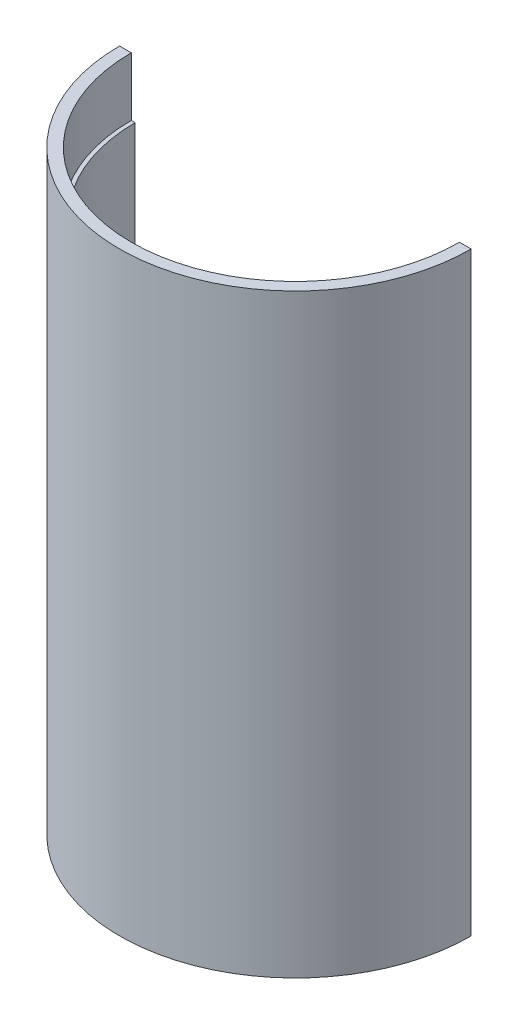
ISO-10303-21;
HEADER;
FILE_DESCRIPTION(('STEP AP214'),'2;1');
FILE_NAME('part.step','',(''),(''),'','','');
FILE_SCHEMA(('AUTOMOTIVE_DESIGN { 1 0 10303 214 1 1 1 1 }'));
ENDSEC;
DATA;
#1=APPLICATION_CONTEXT('core data for automotive mechanical design processes');
#2=APPLICATION_PROTOCOL_DEFINITION('international standard','automotive_design',2000,#1);
#3=PRODUCT_CONTEXT('',#1,'mechanical');
#4=PRODUCT('Part','Part','',(#3));
#5=PRODUCT_RELATED_PRODUCT_CATEGORY('part','',(#4));
#6=PRODUCT_DEFINITION_FORMATION('','',#4);
#7=PRODUCT_DEFINITION_CONTEXT('part definition',#1,'design');
#8=PRODUCT_DEFINITION('design','',#6,#7);
#9=PRODUCT_DEFINITION_SHAPE('','',#8);
#10=(LENGTH_UNIT() NAMED_UNIT(*) SI_UNIT(.MILLI.,.METRE.));
#11=(NAMED_UNIT(*) PLANE_ANGLE_UNIT() SI_UNIT($,.RADIAN.));
#12=(NAMED_UNIT(*) SI_UNIT($,.STERADIAN.) SOLID_ANGLE_UNIT());
#13=UNCERTAINTY_MEASURE_WITH_UNIT(LENGTH_MEASURE(1.E-05),#10,'distance_accuracy_value','');
#14=(GEOMETRIC_REPRESENTATION_CONTEXT(3) GLOBAL_UNCERTAINTY_ASSIGNED_CONTEXT((#13)) GLOBAL_UNIT_ASSIGNED_CONTEXT((#10,
#11,#12)) REPRESENTATION_CONTEXT('',''));
#15=CARTESIAN_POINT('',(0.,0.,0.));
#16=DIRECTION('',(0.,0.,1.));
#17=DIRECTION('',(1.,0.,0.));
#18=AXIS2_PLACEMENT_3D('',#15,#16,#17);
#19=CARTESIAN_POINT('',(0.,0.,0.));
#20=DIRECTION('',(0.,0.,-1.));
#21=DIRECTION('',(-1.,0.,0.));
#22=AXIS2_PLACEMENT_3D('',#19,#20,#21);
#23=PLANE('',#22);
#24=DIRECTION('',(1.,0.,0.));
#25=VECTOR('',#24,1.);
#26=CARTESIAN_POINT('',(-45.,50.75,0.));
#27=LINE('',#26,#25);
#28=CARTESIAN_POINT('',(-45.,50.75,0.));
#29=VERTEX_POINT('',#28);
#30=CARTESIAN_POINT('',(-41.,50.75,0.));
#31=VERTEX_POINT('',#30);
#32=EDGE_CURVE('E11',#29,#31,#27,.T.);
#33=ORIENTED_EDGE('',*,*,#32,.F.);
#34=DIRECTION('',(0.,-1.,0.));
#35=VECTOR('',#34,1.);
#36=CARTESIAN_POINT('',(-45.,0.,0.));
#37=LINE('',#36,#35);
#38=CARTESIAN_POINT('',(-45.,81.05,0.));
#39=VERTEX_POINT('',#38);
#40=EDGE_CURVE('E143',#39,#29,#37,.T.);
#41=ORIENTED_EDGE('',*,*,#40,.F.);
#42=DIRECTION('',(1.,0.,0.));
#43=VECTOR('',#42,1.);
#44=CARTESIAN_POINT('',(-45.,81.05,0.));
#45=LINE('',#44,#43);
#46=CARTESIAN_POINT('',(-41.,81.05,0.));
#47=VERTEX_POINT('',#46);
#48=EDGE_CURVE('E124',#47,#39,#45,.F.);
#49=ORIENTED_EDGE('',*,*,#48,.F.);
#50=DIRECTION('',(0.,1.,0.));
#51=VECTOR('',#50,1.);
#52=CARTESIAN_POINT('',(-41.,137.3,0.));
#53=LINE('',#52,#51);
#54=EDGE_CURVE('E165',#31,#47,#53,.T.);
#55=ORIENTED_EDGE('',*,*,#54,.F.);
#56=EDGE_LOOP('',(#33,#41,#49,#55));
#57=FACE_BOUND('',#56,.T.);
#58=ADVANCED_FACE('F33',(#57),#23,.T.);
#59=DIRECTION('',(1.,0.,0.));
#60=VECTOR('',#59,1.);
#61=CARTESIAN_POINT('',(-45.,101.95,0.));
#62=LINE('',#61,#60);
#63=CARTESIAN_POINT('',(-45.,101.95,0.));
#64=VERTEX_POINT('',#63);
#65=CARTESIAN_POINT('',(-41.,101.95,0.));
#66=VERTEX_POINT('',#65);
#67=EDGE_CURVE('E123',#64,#66,#62,.T.);
#68=ORIENTED_EDGE('',*,*,#67,.F.);
#69=CARTESIAN_POINT('',(-45.,152.3,0.));
#70=VERTEX_POINT('',#69);
#71=EDGE_CURVE('E135',#70,#64,#37,.T.);
#72=ORIENTED_EDGE('',*,*,#71,.F.);
#73=DIRECTION('',(-1.,0.,0.));
#74=VECTOR('',#73,1.);
#75=CARTESIAN_POINT('',(-45.,152.3,0.));
#76=LINE('',#75,#74);
#77=CARTESIAN_POINT('',(-42.,152.3,0.));
#78=VERTEX_POINT('',#77);
#79=EDGE_CURVE('E150',#78,#70,#76,.T.);
#80=ORIENTED_EDGE('',*,*,#79,.F.);
#81=DIRECTION('',(0.,1.,0.));
#82=VECTOR('',#81,1.);
#83=CARTESIAN_POINT('',(-42.,152.3,0.));
#84=LINE('',#83,#82);
#85=CARTESIAN_POINT('',(-42.,137.3,0.));
#86=VERTEX_POINT('',#85);
#87=EDGE_CURVE('E154',#86,#78,#84,.T.);
#88=ORIENTED_EDGE('',*,*,#87,.F.);
#89=DIRECTION('',(-1.,0.,0.));
#90=VECTOR('',#89,1.);
#91=CARTESIAN_POINT('',(-42.,137.3,0.));
#92=LINE('',#91,#90);
#93=CARTESIAN_POINT('',(-41.,137.3,0.));
#94=VERTEX_POINT('',#93);
#95=EDGE_CURVE('E157',#94,#86,#92,.T.);
#96=ORIENTED_EDGE('',*,*,#95,.F.);
#97=EDGE_CURVE('E137',#66,#94,#53,.T.);
#98=ORIENTED_EDGE('',*,*,#97,.F.);
#99=EDGE_LOOP('',(#68,#72,#80,#88,#96,#98));
#100=FACE_BOUND('',#99,.T.);
#101=ADVANCED_FACE('F133',(#100),#23,.T.);
#102=CARTESIAN_POINT('',(43.,0.,-3.00267395140509E-13));
#103=DIRECTION('',(0.,1.,0.));
#104=DIRECTION('',(0.,0.,1.));
#105=AXIS2_PLACEMENT_3D('',#102,#103,#104);
#106=PLANE('',#105);
#107=CARTESIAN_POINT('',(0.,0.,0.));
#108=DIRECTION('',(0.,-1.,0.));
#109=DIRECTION('',(0.,0.,-1.));
#110=AXIS2_PLACEMENT_3D('',#107,#108,#109);
#111=CIRCLE('',#110,45.);
#112=CARTESIAN_POINT('',(45.,0.,-3.14233320495882E-13));
#113=VERTEX_POINT('',#112);
#114=CARTESIAN_POINT('',(-45.,0.,0.));
#115=VERTEX_POINT('',#114);
#116=EDGE_CURVE('E267',#113,#115,#111,.T.);
#117=ORIENTED_EDGE('',*,*,#116,.T.);
#118=DIRECTION('',(1.,0.,0.));
#119=VECTOR('',#118,1.);
#120=CARTESIAN_POINT('',(-43.,0.,0.));
#121=LINE('',#120,#119);
#122=CARTESIAN_POINT('',(-43.,0.,0.));
#123=VERTEX_POINT('',#122);
#124=EDGE_CURVE('E172',#115,#123,#121,.T.);
#125=ORIENTED_EDGE('',*,*,#124,.T.);
#126=CARTESIAN_POINT('',(0.,0.,0.));
#127=DIRECTION('',(0.,-1.,0.));
#128=DIRECTION('',(0.,0.,-1.));
#129=AXIS2_PLACEMENT_3D('',#126,#127,#128);
#130=CIRCLE('',#129,43.);
#131=CARTESIAN_POINT('',(43.,0.,-3.00267395140509E-13));
#132=VERTEX_POINT('',#131);
#133=EDGE_CURVE('E265',#132,#123,#130,.T.);
#134=ORIENTED_EDGE('',*,*,#133,.F.);
#135=DIRECTION('',(-1.,0.,0.));
#136=VECTOR('',#135,1.);
#137=CARTESIAN_POINT('',(43.,0.,-3.00267395140509E-13));
#138=LINE('',#137,#136);
#139=EDGE_CURVE('E142',#113,#132,#138,.T.);
#140=ORIENTED_EDGE('',*,*,#139,.F.);
#141=EDGE_LOOP('',(#117,#125,#134,#140));
#142=FACE_BOUND('',#141,.T.);
#143=ADVANCED_FACE('F229',(#142),#106,.F.);
#144=CARTESIAN_POINT('',(0.,0.,0.));
#145=DIRECTION('',(0.,-1.,0.));
#146=DIRECTION('',(0.,0.,-1.));
#147=AXIS2_PLACEMENT_3D('',#144,#145,#146);
#148=CYLINDRICAL_SURFACE('',#147,45.);
#149=ORIENTED_EDGE('',*,*,#40,.T.);
#150=CARTESIAN_POINT('',(-45.,50.75,0.));
#151=CARTESIAN_POINT('',(-45.0000276800155,50.7500357210877,0.289777309725672));
#152=CARTESIAN_POINT('',(-44.9972019436401,50.7379483375954,0.57954460689438));
#153=CARTESIAN_POINT('',(-44.9860445335122,50.6897890919595,1.15693275383033));
#154=CARTESIAN_POINT('',(-44.9777136395787,50.6537206267896,1.44455390177006));
#155=CARTESIAN_POINT('',(-44.9557658770075,50.5579444786907,2.01510816846415));
#156=CARTESIAN_POINT('',(-44.9421582610212,50.4982781705925,2.29804859427394));
#157=CARTESIAN_POINT('',(-44.9100408958557,50.3558002662414,2.8577546093441));
#158=CARTESIAN_POINT('',(-44.891531109013,50.2729884921616,3.13452015114513));
#159=CARTESIAN_POINT('',(-44.8501147355752,50.0848706756729,3.67994982852666));
#160=CARTESIAN_POINT('',(-44.827208218106,49.9795649869138,3.94861409139983));
#161=CARTESIAN_POINT('',(-44.7776201597931,49.7472556749073,4.47603613105494));
#162=CARTESIAN_POINT('',(-44.7509384933737,49.6202513298512,4.73479357793464));
#163=CARTESIAN_POINT('',(-44.6945151440581,49.3454552017206,5.24071761689439));
#164=CARTESIAN_POINT('',(-44.6647730406244,49.1976605608047,5.48788260923275));
#165=CARTESIAN_POINT('',(-44.6030274796608,48.8823339966548,5.9689839026558));
#166=CARTESIAN_POINT('',(-44.5710240009458,48.714801888505,6.20292007977238));
#167=CARTESIAN_POINT('',(-44.5050924762665,48.3583439515707,6.65964135297352));
#168=CARTESIAN_POINT('',(-44.4711420462593,48.1691225371176,6.88219256689107));
#169=CARTESIAN_POINT('',(-44.4027063740719,47.7726809108777,7.31073056333741));
#170=CARTESIAN_POINT('',(-44.3682209066601,47.5654529402645,7.51671013096726));
#171=CARTESIAN_POINT('',(-44.2996758377473,47.1344021322261,7.91067094745145));
#172=CARTESIAN_POINT('',(-44.2656163178082,46.9105761717422,8.09864879379812));
#173=CARTESIAN_POINT('',(-44.1988949480916,46.4479407299924,8.45521016672256));
#174=CARTESIAN_POINT('',(-44.1662324808841,46.2091379852729,8.62380231764495));
#175=CARTESIAN_POINT('',(-44.102805978378,45.714870135673,8.94255342556756));
#176=CARTESIAN_POINT('',(-44.07207175211,45.4592302709518,9.09244750411398));
#177=CARTESIAN_POINT('',(-44.0138722700214,44.9358467715346,9.37012181144229));
#178=CARTESIAN_POINT('',(-43.986407049653,44.6681030056152,9.49790180040344));
#179=CARTESIAN_POINT('',(-43.9355744123609,44.1224295907866,9.73033721907349));
#180=CARTESIAN_POINT('',(-43.9122063453421,43.8445015662892,9.83499631805872));
#181=CARTESIAN_POINT('',(-43.8702780793081,43.2804177252759,10.0203663892489));
#182=CARTESIAN_POINT('',(-43.8517177816039,42.994262077782,10.1010778530311));
#183=CARTESIAN_POINT('',(-43.8202587597688,42.4208699091378,10.236683348427));
#184=CARTESIAN_POINT('',(-43.8072670590479,42.1337390177997,10.2920025549074));
#185=CARTESIAN_POINT('',(-43.7868786377794,41.5556558022234,10.3784023672529));
#186=CARTESIAN_POINT('',(-43.7794818586421,41.2647035180351,10.4094832269407));
#187=CARTESIAN_POINT('',(-43.7705115128661,40.6811565609188,10.447138279155));
#188=CARTESIAN_POINT('',(-43.768937370472,40.3885620532433,10.4537148947167));
#189=CARTESIAN_POINT('',(-43.7716595109905,39.8038813767438,10.44231098683));
#190=CARTESIAN_POINT('',(-43.7759557250889,39.5117952020011,10.4243307512446));
#191=CARTESIAN_POINT('',(-43.7901365482015,38.9363331148385,10.36459622385));
#192=CARTESIAN_POINT('',(-43.7999034561101,38.6529021621148,10.3233425266223));
#193=CARTESIAN_POINT('',(-43.8246509352537,38.0906056127654,10.2177739892246));
#194=CARTESIAN_POINT('',(-43.8396314235995,37.8117399436316,10.1534595156903));
#195=CARTESIAN_POINT('',(-43.8743711704448,37.260489161261,10.0022778543845));
#196=CARTESIAN_POINT('',(-43.8941305939915,36.9881042722038,9.91540988768915));
#197=CARTESIAN_POINT('',(-43.9378623089173,36.4516598870526,9.71978867776954));
#198=CARTESIAN_POINT('',(-43.9618346578823,36.1876005048167,9.61103513539172));
#199=CARTESIAN_POINT('',(-44.0135418022761,35.6672940932836,9.37140774386989));
#200=CARTESIAN_POINT('',(-44.0413074905735,35.4111349218959,9.24034983651237));
#201=CARTESIAN_POINT('',(-44.0996692587863,34.9106462470551,8.95767801468011));
#202=CARTESIAN_POINT('',(-44.1302663170916,34.666320877578,8.80605698605593));
#203=CARTESIAN_POINT('',(-44.1934355695442,34.1911787630675,8.48335264270418));
#204=CARTESIAN_POINT('',(-44.2260076239021,33.9603610642351,8.31227070466109));
#205=CARTESIAN_POINT('',(-44.2922435633056,33.5136801809737,7.95177574041558));
#206=CARTESIAN_POINT('',(-44.3259074663898,33.2978172438002,7.76236241125391));
#207=CARTESIAN_POINT('',(-44.3942521323976,32.8773172454835,7.36156910330172));
#208=CARTESIAN_POINT('',(-44.428937567788,32.673085953596,7.14976396086327));
#209=CARTESIAN_POINT('',(-44.4975237403146,32.28320857827,6.70969054621079));
#210=CARTESIAN_POINT('',(-44.5314247174091,32.0975567521945,6.48142739868475));
#211=CARTESIAN_POINT('',(-44.5975233947688,31.7459701227995,6.00979385571237));
#212=CARTESIAN_POINT('',(-44.6297203277866,31.5800441598631,5.76641676059641));
#213=CARTESIAN_POINT('',(-44.6914942814793,31.2691986936579,5.26629010249474));
#214=CARTESIAN_POINT('',(-44.7210713884812,31.1242784981188,5.00954098057933));
#215=CARTESIAN_POINT('',(-44.7768669634992,30.8560821526274,4.48356343270576));
#216=CARTESIAN_POINT('',(-44.8030742475729,30.7328775963967,4.2142972950596));
#217=CARTESIAN_POINT('',(-44.8512704622542,30.5096554891393,3.6659612448561));
#218=CARTESIAN_POINT('',(-44.8732595601175,30.4096370187265,3.38689172153288));
#219=CARTESIAN_POINT('',(-44.9123652967802,30.2336991585479,2.82129393809283));
#220=CARTESIAN_POINT('',(-44.9294877494991,30.1577510006794,2.53477502801466));
#221=CARTESIAN_POINT('',(-44.9583943090884,30.0304548356529,1.95617799466032));
#222=CARTESIAN_POINT('',(-44.9701809147014,29.9790953131466,1.66410254039114));
#223=CARTESIAN_POINT('',(-44.9860526551791,29.9101823705245,1.14311820517071));
#224=CARTESIAN_POINT('',(-44.9912777925168,29.8876053942516,0.914894978036251));
#225=CARTESIAN_POINT('',(-44.9982534977653,29.8575212566626,0.457787633365784));
#226=CARTESIAN_POINT('',(-45.0000098480237,29.8499890160567,0.228905253699298));
#227=CARTESIAN_POINT('',(-45.,29.85,0.));
#228=B_SPLINE_CURVE_WITH_KNOTS('',3,(#150,#151,#152,#153,#154,#155,#156,#157,#158,#159,#160,
#161,#162,#163,#164,#165,#166,#167,#168,#169,#170,#171,#172,#173,#174,#175,#176,#177,#178,#179,
#180,#181,#182,#183,#184,#185,#186,#187,#188,#189,#190,#191,#192,#193,#194,#195,#196,#197,#198,
#199,#200,#201,#202,#203,#204,#205,#206,#207,#208,#209,#210,#211,#212,#213,#214,#215,#216,#217,
#218,#219,#220,#221,#222,#223,#224,#225,#226,#227),.UNSPECIFIED.,.F.,.F.,(4,2,2,2,2,2,2,2,2,2,2,
2,2,2,2,2,2,2,2,2,2,2,2,2,2,2,2,2,2,2,2,2,2,2,2,2,2,2,4),(0.,0.869051020991656,1.73797896518927,
2.60539009752773,3.47280789437725,4.34021205467291,5.20764507490828,6.07519744952519,
6.94275795268703,7.82399292451696,8.70560951180641,9.58739240603099,10.4687814807012,
11.3615031237839,12.2542344475604,13.1468239932811,14.039395215396,14.9164206554535,
15.7934369112204,16.6703664433302,17.5472856958948,18.4060252787349,19.2647512093627,
20.1235068015189,20.9822741327883,21.8485060790335,22.7150384805929,23.581509620848,
24.447995083546,25.3357556572325,26.2232409843077,27.1111225611052,27.9989748700519,
28.889701685639,29.7803931756462,30.6700160885064,31.559221964677,32.246910182196,
32.9334510765203),.UNSPECIFIED.);
#229=CARTESIAN_POINT('',(-45.,29.85,0.));
#230=VERTEX_POINT('',#229);
#231=EDGE_CURVE('E175',#29,#230,#228,.T.);
#232=ORIENTED_EDGE('',*,*,#231,.T.);
#233=EDGE_CURVE('E145',#230,#115,#37,.T.);
#234=ORIENTED_EDGE('',*,*,#233,.T.);
#235=ORIENTED_EDGE('',*,*,#116,.F.);
#236=DIRECTION('',(0.,-1.,0.));
#237=VECTOR('',#236,1.);
#238=CARTESIAN_POINT('',(45.,0.,-3.14233320495882E-13));
#239=LINE('',#238,#237);
#240=CARTESIAN_POINT('',(45.,152.3,-3.14233320495882E-13));
#241=VERTEX_POINT('',#240);
#242=EDGE_CURVE('E281',#241,#113,#239,.T.);
#243=ORIENTED_EDGE('',*,*,#242,.F.);
#244=CARTESIAN_POINT('',(0.,152.3,0.));
#245=DIRECTION('',(0.,-1.,0.));
#246=DIRECTION('',(0.,0.,-1.));
#247=AXIS2_PLACEMENT_3D('',#244,#245,#246);
#248=CIRCLE('',#247,45.);
#249=EDGE_CURVE('E140',#241,#70,#248,.T.);
#250=ORIENTED_EDGE('',*,*,#249,.T.);
#251=ORIENTED_EDGE('',*,*,#71,.T.);
#252=CARTESIAN_POINT('',(-45.,101.95,0.));
#253=CARTESIAN_POINT('',(-45.0000276800155,101.950035721088,0.289777309725673));
#254=CARTESIAN_POINT('',(-44.9972019436401,101.937948337595,0.57954460689438));
#255=CARTESIAN_POINT('',(-44.9860445335122,101.88978909196,1.15693275383033));
#256=CARTESIAN_POINT('',(-44.9777136395787,101.85372062679,1.44455390177006));
#257=CARTESIAN_POINT('',(-44.9557658770075,101.757944478691,2.01510816846415));
#258=CARTESIAN_POINT('',(-44.9421582610212,101.698278170593,2.29804859427394));
#259=CARTESIAN_POINT('',(-44.9100408958557,101.555800266241,2.8577546093441));
#260=CARTESIAN_POINT('',(-44.891531109013,101.472988492162,3.13452015114513));
#261=CARTESIAN_POINT('',(-44.8501147355752,101.284870675673,3.67994982852666));
#262=CARTESIAN_POINT('',(-44.827208218106,101.179564986914,3.94861409139983));
#263=CARTESIAN_POINT('',(-44.7776201597931,100.947255674907,4.47603613105494));
#264=CARTESIAN_POINT('',(-44.7509384933737,100.820251329851,4.73479357793464));
#265=CARTESIAN_POINT('',(-44.6945151440581,100.545455201721,5.24071761689439));
#266=CARTESIAN_POINT('',(-44.6647730406244,100.397660560805,5.48788260923275));
#267=CARTESIAN_POINT('',(-44.6030274796608,100.082333996655,5.96898390265581));
#268=CARTESIAN_POINT('',(-44.5710240009458,99.914801888505,6.20292007977238));
#269=CARTESIAN_POINT('',(-44.5050924762665,99.5583439515707,6.65964135297353));
#270=CARTESIAN_POINT('',(-44.4711420462593,99.3691225371176,6.88219256689109));
#271=CARTESIAN_POINT('',(-44.4027063740719,98.9726809108777,7.31073056333743));
#272=CARTESIAN_POINT('',(-44.3682209066601,98.7654529402645,7.51671013096727));
#273=CARTESIAN_POINT('',(-44.2996758377473,98.334402132226,7.91067094745146));
#274=CARTESIAN_POINT('',(-44.2656163178082,98.1105761717422,8.09864879379813));
#275=CARTESIAN_POINT('',(-44.1988949480916,97.6479407299924,8.45521016672256));
#276=CARTESIAN_POINT('',(-44.1662324808841,97.4091379852729,8.62380231764496));
#277=CARTESIAN_POINT('',(-44.102805978378,96.914870135673,8.94255342556756));
#278=CARTESIAN_POINT('',(-44.07207175211,96.6592302709518,9.09244750411399));
#279=CARTESIAN_POINT('',(-44.0138722700214,96.1358467715346,9.37012181144229));
#280=CARTESIAN_POINT('',(-43.986407049653,95.8681030056152,9.49790180040345));
#281=CARTESIAN_POINT('',(-43.9355744123609,95.3224295907866,9.73033721907349));
#282=CARTESIAN_POINT('',(-43.9122063453421,95.0445015662893,9.83499631805872));
#283=CARTESIAN_POINT('',(-43.8702780793081,94.4804177252759,10.0203663892489));
#284=CARTESIAN_POINT('',(-43.8517177816039,94.194262077782,10.1010778530311));
#285=CARTESIAN_POINT('',(-43.8202587597688,93.6208699091379,10.236683348427));
#286=CARTESIAN_POINT('',(-43.8072670590479,93.3337390177998,10.2920025549074));
#287=CARTESIAN_POINT('',(-43.7868786377794,92.7556558022234,10.3784023672529));
#288=CARTESIAN_POINT('',(-43.7794818586421,92.4647035180351,10.4094832269407));
#289=CARTESIAN_POINT('',(-43.7705115128661,91.8811565609188,10.4471382791551));
#290=CARTESIAN_POINT('',(-43.768937370472,91.5885620532433,10.4537148947167));
#291=CARTESIAN_POINT('',(-43.7716595109905,91.0038813767438,10.44231098683));
#292=CARTESIAN_POINT('',(-43.7759557250889,90.7117952020012,10.4243307512446));
#293=CARTESIAN_POINT('',(-43.7901365482015,90.1363331148385,10.36459622385));
#294=CARTESIAN_POINT('',(-43.7999034561101,89.8529021621148,10.3233425266223));
#295=CARTESIAN_POINT('',(-43.8246509352537,89.2906056127654,10.2177739892246));
#296=CARTESIAN_POINT('',(-43.8396314235995,89.0117399436316,10.1534595156903));
#297=CARTESIAN_POINT('',(-43.8743711704448,88.460489161261,10.0022778543845));
#298=CARTESIAN_POINT('',(-43.8941305939915,88.1881042722038,9.91540988768916));
#299=CARTESIAN_POINT('',(-43.9378623089173,87.6516598870526,9.71978867776956));
#300=CARTESIAN_POINT('',(-43.9618346578823,87.3876005048167,9.61103513539174));
#301=CARTESIAN_POINT('',(-44.0135418022761,86.8672940932836,9.37140774386991));
#302=CARTESIAN_POINT('',(-44.0413074905735,86.6111349218959,9.24034983651239));
#303=CARTESIAN_POINT('',(-44.0996692587862,86.1106462470552,8.95767801468013));
#304=CARTESIAN_POINT('',(-44.1302663170916,85.866320877578,8.80605698605595));
#305=CARTESIAN_POINT('',(-44.1934355695442,85.3911787630676,8.4833526427042));
#306=CARTESIAN_POINT('',(-44.2260076239021,85.1603610642351,8.31227070466112));
#307=CARTESIAN_POINT('',(-44.2922435633056,84.7136801809737,7.95177574041561));
#308=CARTESIAN_POINT('',(-44.3259074663898,84.4978172438002,7.76236241125393));
#309=CARTESIAN_POINT('',(-44.3942521323976,84.0773172454835,7.36156910330174));
#310=CARTESIAN_POINT('',(-44.428937567788,83.873085953596,7.14976396086329));
#311=CARTESIAN_POINT('',(-44.4975237403145,83.4832085782701,6.70969054621081));
#312=CARTESIAN_POINT('',(-44.5314247174091,83.2975567521945,6.48142739868477));
#313=CARTESIAN_POINT('',(-44.5975233947688,82.9459701227995,6.0097938557124));
#314=CARTESIAN_POINT('',(-44.6297203277866,82.7800441598632,5.76641676059644));
#315=CARTESIAN_POINT('',(-44.6914942814793,82.4691986936579,5.26629010249476));
#316=CARTESIAN_POINT('',(-44.7210713884812,82.3242784981188,5.00954098057935));
#317=CARTESIAN_POINT('',(-44.7768669634992,82.0560821526274,4.48356343270578));
#318=CARTESIAN_POINT('',(-44.8030742475729,81.9328775963967,4.21429729505962));
#319=CARTESIAN_POINT('',(-44.8512704622542,81.7096554891393,3.66596124485612));
#320=CARTESIAN_POINT('',(-44.8732595601175,81.6096370187265,3.3868917215329));
#321=CARTESIAN_POINT('',(-44.9123652967802,81.433699158548,2.82129393809285));
#322=CARTESIAN_POINT('',(-44.9294877494991,81.3577510006794,2.53477502801468));
#323=CARTESIAN_POINT('',(-44.9583943090884,81.2304548356529,1.95617799466034));
#324=CARTESIAN_POINT('',(-44.9701809147014,81.1790953131466,1.66410254039116));
#325=CARTESIAN_POINT('',(-44.9860526551791,81.1101823705245,1.14311820517072));
#326=CARTESIAN_POINT('',(-44.9912777925168,81.0876053942516,0.914894978036265));
#327=CARTESIAN_POINT('',(-44.9982534977653,81.0575212566626,0.457787633365793));
#328=CARTESIAN_POINT('',(-45.0000098480237,81.0499890160566,0.228905253699304));
#329=CARTESIAN_POINT('',(-45.,81.05,0.));
#330=B_SPLINE_CURVE_WITH_KNOTS('',3,(#252,#253,#254,#255,#256,#257,#258,#259,#260,#261,#262,
#263,#264,#265,#266,#267,#268,#269,#270,#271,#272,#273,#274,#275,#276,#277,#278,#279,#280,#281,
#282,#283,#284,#285,#286,#287,#288,#289,#290,#291,#292,#293,#294,#295,#296,#297,#298,#299,#300,
#301,#302,#303,#304,#305,#306,#307,#308,#309,#310,#311,#312,#313,#314,#315,#316,#317,#318,#319,
#320,#321,#322,#323,#324,#325,#326,#327,#328,#329),.UNSPECIFIED.,.F.,.F.,(4,2,2,2,2,2,2,2,2,2,2,
2,2,2,2,2,2,2,2,2,2,2,2,2,2,2,2,2,2,2,2,2,2,2,2,2,2,2,4),(0.,0.869051020991656,1.73797896518928,
2.60539009752773,3.47280789437725,4.34021205467291,5.20764507490828,6.07519744952519,
6.94275795268703,7.82399292451697,8.70560951180641,9.58739240603099,10.4687814807012,
11.3615031237839,12.2542344475604,13.146823993281,14.039395215396,14.9164206554535,
15.7934369112204,16.6703664433302,17.5472856958948,18.4060252787349,19.2647512093627,
20.1235068015189,20.9822741327882,21.8485060790335,22.7150384805928,23.581509620848,
24.447995083546,25.3357556572325,26.2232409843077,27.1111225611052,27.9989748700519,
28.889701685639,29.7803931756462,30.6700160885064,31.5592219646771,32.246910182196,
32.9334510765203),.UNSPECIFIED.);
#331=EDGE_CURVE('E120',#64,#39,#330,.T.);
#332=ORIENTED_EDGE('',*,*,#331,.T.);
#333=EDGE_LOOP('',(#149,#232,#234,#235,#243,#250,#251,#332));
#334=FACE_BOUND('',#333,.T.);
#335=ADVANCED_FACE('F35',(#334),#148,.T.);
#336=CARTESIAN_POINT('',(45.,152.3,-3.14233320495882E-13));
#337=DIRECTION('',(0.,-1.,0.));
#338=DIRECTION('',(0.,0.,-1.));
#339=AXIS2_PLACEMENT_3D('',#336,#337,#338);
#340=PLANE('',#339);
#341=CARTESIAN_POINT('',(0.,152.3,0.));
#342=DIRECTION('',(0.,-1.,0.));
#343=DIRECTION('',(0.,0.,-1.));
#344=AXIS2_PLACEMENT_3D('',#341,#342,#343);
#345=CIRCLE('',#344,42.);
#346=CARTESIAN_POINT('',(42.,152.3,-2.93284432462823E-13));
#347=VERTEX_POINT('',#346);
#348=EDGE_CURVE('E271',#347,#78,#345,.T.);
#349=ORIENTED_EDGE('',*,*,#348,.T.);
#350=ORIENTED_EDGE('',*,*,#79,.T.);
#351=ORIENTED_EDGE('',*,*,#249,.F.);
#352=DIRECTION('',(1.,0.,0.));
#353=VECTOR('',#352,1.);
#354=CARTESIAN_POINT('',(45.,152.3,-3.14233320495882E-13));
#355=LINE('',#354,#353);
#356=EDGE_CURVE('E283',#347,#241,#355,.T.);
#357=ORIENTED_EDGE('',*,*,#356,.F.);
#358=EDGE_LOOP('',(#349,#350,#351,#357));
#359=FACE_BOUND('',#358,.T.);
#360=ADVANCED_FACE('F222',(#359),#340,.F.);
#361=CARTESIAN_POINT('',(0.,0.,0.));
#362=DIRECTION('',(0.,-1.,0.));
#363=DIRECTION('',(0.,0.,-1.));
#364=AXIS2_PLACEMENT_3D('',#361,#362,#363);
#365=CYLINDRICAL_SURFACE('',#364,42.);
#366=CARTESIAN_POINT('',(0.,137.3,0.));
#367=DIRECTION('',(0.,-1.,0.));
#368=DIRECTION('',(0.,0.,-1.));
#369=AXIS2_PLACEMENT_3D('',#366,#367,#368);
#370=CIRCLE('',#369,42.);
#371=CARTESIAN_POINT('',(42.,137.3,-2.93284432462823E-13));
#372=VERTEX_POINT('',#371);
#373=EDGE_CURVE('E275',#372,#86,#370,.T.);
#374=ORIENTED_EDGE('',*,*,#373,.T.);
#375=ORIENTED_EDGE('',*,*,#87,.T.);
#376=ORIENTED_EDGE('',*,*,#348,.F.);
#377=DIRECTION('',(0.,1.,0.));
#378=VECTOR('',#377,1.);
#379=CARTESIAN_POINT('',(42.,152.3,-2.93284432462823E-13));
#380=LINE('',#379,#378);
#381=EDGE_CURVE('E286',#372,#347,#380,.T.);
#382=ORIENTED_EDGE('',*,*,#381,.F.);
#383=EDGE_LOOP('',(#374,#375,#376,#382));
#384=FACE_BOUND('',#383,.T.);
#385=ADVANCED_FACE('F219',(#384),#365,.F.);
#386=CARTESIAN_POINT('',(42.,137.3,-2.93284432462823E-13));
#387=DIRECTION('',(0.,-1.,0.));
#388=DIRECTION('',(0.,0.,-1.));
#389=AXIS2_PLACEMENT_3D('',#386,#387,#388);
#390=PLANE('',#389);
#391=CARTESIAN_POINT('',(0.,137.3,0.));
#392=DIRECTION('',(0.,-1.,0.));
#393=DIRECTION('',(0.,0.,-1.));
#394=AXIS2_PLACEMENT_3D('',#391,#392,#393);
#395=CIRCLE('',#394,41.);
#396=CARTESIAN_POINT('',(41.,137.3,-2.86301469785137E-13));
#397=VERTEX_POINT('',#396);
#398=EDGE_CURVE('E258',#397,#94,#395,.T.);
#399=ORIENTED_EDGE('',*,*,#398,.T.);
#400=ORIENTED_EDGE('',*,*,#95,.T.);
#401=ORIENTED_EDGE('',*,*,#373,.F.);
#402=DIRECTION('',(1.,0.,0.));
#403=VECTOR('',#402,1.);
#404=CARTESIAN_POINT('',(42.,137.3,-2.93284432462823E-13));
#405=LINE('',#404,#403);
#406=EDGE_CURVE('E289',#397,#372,#405,.T.);
#407=ORIENTED_EDGE('',*,*,#406,.F.);
#408=EDGE_LOOP('',(#399,#400,#401,#407));
#409=FACE_BOUND('',#408,.T.);
#410=ADVANCED_FACE('F213',(#409),#390,.F.);
#411=CARTESIAN_POINT('',(0.,0.,0.));
#412=DIRECTION('',(0.,-1.,0.));
#413=DIRECTION('',(0.,0.,-1.));
#414=AXIS2_PLACEMENT_3D('',#411,#412,#413);
#415=CYLINDRICAL_SURFACE('',#414,41.);
#416=CARTESIAN_POINT('',(-41.,15.,0.));
#417=VERTEX_POINT('',#416);
#418=CARTESIAN_POINT('',(-41.,29.85,0.));
#419=VERTEX_POINT('',#418);
#420=EDGE_CURVE('E162',#417,#419,#53,.T.);
#421=ORIENTED_EDGE('',*,*,#420,.T.);
#422=CARTESIAN_POINT('',(-41.,29.85,0.));
#423=CARTESIAN_POINT('',(-41.0000300908221,29.8499634960627,0.288949045719678));
#424=CARTESIAN_POINT('',(-40.9969464954975,29.8619828111729,0.577887055905711));
#425=CARTESIAN_POINT('',(-40.9847705103606,29.9098650124593,1.15360853633391));
#426=CARTESIAN_POINT('',(-40.9756790787604,29.9457240963479,1.4403923427822));
#427=CARTESIAN_POINT('',(-40.9517291598623,30.0409253463215,2.00921327123784));
#428=CARTESIAN_POINT('',(-40.9368819124435,30.1002217487195,2.29125853347753));
#429=CARTESIAN_POINT('',(-40.9018368426846,30.2417949489011,2.84918040889963));
#430=CARTESIAN_POINT('',(-40.8816389591213,30.3240720096356,3.12505695145886));
#431=CARTESIAN_POINT('',(-40.8364462022114,30.5109224896339,3.66865761120273));
#432=CARTESIAN_POINT('',(-40.8114526525844,30.6154897571441,3.93638395446634));
#433=CARTESIAN_POINT('',(-40.7573281291748,30.8461718034927,4.46206839064162));
#434=CARTESIAN_POINT('',(-40.7281956014181,30.9722946789826,4.7200227683968));
#435=CARTESIAN_POINT('',(-40.6665825242039,31.2451074055102,5.22432707858392));
#436=CARTESIAN_POINT('',(-40.6341026263814,31.391793255534,5.47067925607087));
#437=CARTESIAN_POINT('',(-40.5666331634962,31.7047929970163,5.95037617701195));
#438=CARTESIAN_POINT('',(-40.5316424540135,31.8711158615424,6.18371490174975));
#439=CARTESIAN_POINT('',(-40.4594036244395,32.2255646164054,6.64010958075305));
#440=CARTESIAN_POINT('',(-40.4221252173564,32.4140451865979,6.86288535167456));
#441=CARTESIAN_POINT('',(-40.3469665486965,32.8088229375611,7.29175400391124));
#442=CARTESIAN_POINT('',(-40.3090865527214,33.0151124248499,7.49785401537473));
#443=CARTESIAN_POINT('',(-40.2337254509553,33.4443583970056,7.89225432057257));
#444=CARTESIAN_POINT('',(-40.1962445964451,33.6673247453319,8.08054392894189));
#445=CARTESIAN_POINT('',(-40.1227591803274,34.1282866435724,8.43785890872699));
#446=CARTESIAN_POINT('',(-40.086754071784,34.3662765409068,8.60689145922259));
#447=CARTESIAN_POINT('',(-40.0166723032592,34.8596770795338,8.92710665592181));
#448=CARTESIAN_POINT('',(-39.9826349020918,35.1153029127895,9.07796658183946));
#449=CARTESIAN_POINT('',(-39.9181241644402,35.6388198075485,9.35756163391271));
#450=CARTESIAN_POINT('',(-39.8876508752346,35.906711031689,9.4862964665851));
#451=CARTESIAN_POINT('',(-39.8311985368189,36.4528428888124,9.72060459565471));
#452=CARTESIAN_POINT('',(-39.8052186752466,36.7310816400013,9.82618207957379));
#453=CARTESIAN_POINT('',(-39.7585537749444,37.2959520202728,10.0133268230456));
#454=CARTESIAN_POINT('',(-39.7378686036028,37.5825834389508,10.0948946839553));
#455=CARTESIAN_POINT('',(-39.7028160067754,38.1560990991838,10.2318765962674));
#456=CARTESIAN_POINT('',(-39.6883263864554,38.4428546644182,10.2877982519643));
#457=CARTESIAN_POINT('',(-39.6655009252325,39.0202824106282,10.3754563559173));
#458=CARTESIAN_POINT('',(-39.6571650072439,39.3109545424955,10.4071931071313));
#459=CARTESIAN_POINT('',(-39.6469087655228,39.8940124980381,10.4461970978952));
#460=CARTESIAN_POINT('',(-39.6449876373776,40.1863981022377,10.4534674055311));
#461=CARTESIAN_POINT('',(-39.6476194094649,40.7707185161935,10.4434813602793));
#462=CARTESIAN_POINT('',(-39.6521722155371,41.0626533324443,10.4262253641153));
#463=CARTESIAN_POINT('',(-39.6674121737063,41.636518155762,10.3680895666594));
#464=CARTESIAN_POINT('',(-39.6779411036398,41.9185143382178,10.3278189125675));
#465=CARTESIAN_POINT('',(-39.7046994186357,42.4780125332845,10.2244652357696));
#466=CARTESIAN_POINT('',(-39.7209286931219,42.7555146329631,10.1613826555721));
#467=CARTESIAN_POINT('',(-39.7586141446975,43.3041309333531,10.0129146132435));
#468=CARTESIAN_POINT('',(-39.7800705381324,43.5752448691551,9.92752822796851));
#469=CARTESIAN_POINT('',(-39.8275942091134,44.1092654532585,9.73511944450197));
#470=CARTESIAN_POINT('',(-39.85366156166,44.3721719679785,9.62809669437545));
#471=CARTESIAN_POINT('',(-39.9099622847818,44.8907199414175,9.39200615078382));
#472=CARTESIAN_POINT('',(-39.9402356613138,45.1462591619046,9.26272340479883));
#473=CARTESIAN_POINT('',(-40.0039028495937,45.6456632406273,8.98377537586267));
#474=CARTESIAN_POINT('',(-40.037297738359,45.8895240252286,8.83410304967338));
#475=CARTESIAN_POINT('',(-40.1062805712605,46.3639365784732,8.51544610753037));
#476=CARTESIAN_POINT('',(-40.1418684223477,46.5944889110006,8.34646231071649));
#477=CARTESIAN_POINT('',(-40.21427973283,47.0408686340992,7.99028931473066));
#478=CARTESIAN_POINT('',(-40.2511032170426,47.2566957286523,7.80309974975587));
#479=CARTESIAN_POINT('',(-40.3261088080232,47.6784755403438,7.40587578075969));
#480=CARTESIAN_POINT('',(-40.3642987202239,47.8839428607258,7.19532710125152));
#481=CARTESIAN_POINT('',(-40.4398745026115,48.276404507459,6.75765070954009));
#482=CARTESIAN_POINT('',(-40.4772606156831,48.4634044772663,6.53052809930489));
#483=CARTESIAN_POINT('',(-40.5502198896119,48.8178004262074,6.06103268492889));
#484=CARTESIAN_POINT('',(-40.5857922417044,48.9851877023884,5.8186531834656));
#485=CARTESIAN_POINT('',(-40.6541156911115,49.2990606822961,5.32034852534884));
#486=CARTESIAN_POINT('',(-40.6868668814607,49.4455470753846,5.06442381583099));
#487=CARTESIAN_POINT('',(-40.7487655838728,49.7171099388726,4.53962565001769));
#488=CARTESIAN_POINT('',(-40.77789706061,49.8420920235265,4.27070142899891));
#489=CARTESIAN_POINT('',(-40.8315612085458,50.0688809965223,3.72281600824344));
#490=CARTESIAN_POINT('',(-40.8560940782548,50.1706888852776,3.44385524237946));
#491=CARTESIAN_POINT('',(-40.8998300533584,50.3501828477058,2.8782385182505));
#492=CARTESIAN_POINT('',(-40.9190394706386,50.4278975012266,2.59159211897238));
#493=CARTESIAN_POINT('',(-40.9516032172164,50.5586699912833,2.01252190027506));
#494=CARTESIAN_POINT('',(-40.9649602601481,50.6117392561003,1.72010082433728));
#495=CARTESIAN_POINT('',(-40.9834199618164,50.6848079160059,1.18959984924041));
#496=CARTESIAN_POINT('',(-40.9896302799566,50.7092621818857,0.952161664078488));
#497=CARTESIAN_POINT('',(-40.9979233941627,50.7418518918865,0.47648867551196));
#498=CARTESIAN_POINT('',(-41.0000129476557,50.7500140528484,0.238255819091006));
#499=CARTESIAN_POINT('',(-41.,50.75,0.));
#500=B_SPLINE_CURVE_WITH_KNOTS('',3,(#422,#423,#424,#425,#426,#427,#428,#429,#430,#431,#432,
#433,#434,#435,#436,#437,#438,#439,#440,#441,#442,#443,#444,#445,#446,#447,#448,#449,#450,#451,
#452,#453,#454,#455,#456,#457,#458,#459,#460,#461,#462,#463,#464,#465,#466,#467,#468,#469,#470,
#471,#472,#473,#474,#475,#476,#477,#478,#479,#480,#481,#482,#483,#484,#485,#486,#487,#488,#489,
#490,#491,#492,#493,#494,#495,#496,#497,#498,#499),.UNSPECIFIED.,.F.,.F.,(4,2,2,2,2,2,2,2,2,2,2,
2,2,2,2,2,2,2,2,2,2,2,2,2,2,2,2,2,2,2,2,2,2,2,2,2,2,2,4),(0.,0.866564036423613,1.73298989468528,
2.59773226252069,3.46248452538039,4.32699843821564,5.19183779366374,6.05650910708846,
6.92157706958048,7.80310730817704,8.68425861187458,9.56593525378722,10.447282121323,
11.3424970287875,12.2377238101124,13.1327885747053,14.0278309191551,14.9042998452121,
15.7807577917921,16.657105826668,17.533441115596,18.3875901136003,19.2417225435994,
20.0958903313329,20.9500720139935,21.8130191673179,22.6762651707078,23.5394745711415,
24.4027013193582,25.2916323730649,26.1802909313566,27.0693423421797,27.9583644231531,
28.8511941812792,29.7439853892745,30.6357134632001,31.52702762116,32.2427769608012,
32.9573516012028),.UNSPECIFIED.);
#501=EDGE_CURVE('E56',#419,#31,#500,.T.);
#502=ORIENTED_EDGE('',*,*,#501,.T.);
#503=ORIENTED_EDGE('',*,*,#54,.T.);
#504=CARTESIAN_POINT('',(-41.,81.05,0.));
#505=CARTESIAN_POINT('',(-41.0000300908221,81.0499634960627,0.288949045719678));
#506=CARTESIAN_POINT('',(-40.9969464954975,81.0619828111729,0.577887055905712));
#507=CARTESIAN_POINT('',(-40.9847705103606,81.1098650124593,1.15360853633391));
#508=CARTESIAN_POINT('',(-40.9756790787604,81.1457240963479,1.4403923427822));
#509=CARTESIAN_POINT('',(-40.9517291598623,81.2409253463214,2.00921327123784));
#510=CARTESIAN_POINT('',(-40.9368819124435,81.3002217487195,2.29125853347753));
#511=CARTESIAN_POINT('',(-40.9018368426846,81.4417949489011,2.84918040889964));
#512=CARTESIAN_POINT('',(-40.8816389591213,81.5240720096356,3.12505695145886));
#513=CARTESIAN_POINT('',(-40.8364462022114,81.7109224896339,3.66865761120274));
#514=CARTESIAN_POINT('',(-40.8114526525844,81.8154897571441,3.93638395446634));
#515=CARTESIAN_POINT('',(-40.7573281291748,82.0461718034927,4.46206839064162));
#516=CARTESIAN_POINT('',(-40.7281956014181,82.1722946789826,4.72002276839681));
#517=CARTESIAN_POINT('',(-40.6665825242039,82.4451074055102,5.22432707858393));
#518=CARTESIAN_POINT('',(-40.6341026263814,82.591793255534,5.47067925607087));
#519=CARTESIAN_POINT('',(-40.5666331634962,82.9047929970163,5.95037617701196));
#520=CARTESIAN_POINT('',(-40.5316424540135,83.0711158615424,6.18371490174975));
#521=CARTESIAN_POINT('',(-40.4594036244395,83.4255646164054,6.64010958075306));
#522=CARTESIAN_POINT('',(-40.4221252173564,83.6140451865979,6.86288535167457));
#523=CARTESIAN_POINT('',(-40.3469665486965,84.0088229375611,7.29175400391125));
#524=CARTESIAN_POINT('',(-40.3090865527214,84.2151124248499,7.49785401537473));
#525=CARTESIAN_POINT('',(-40.2337254509553,84.6443583970056,7.89225432057257));
#526=CARTESIAN_POINT('',(-40.1962445964451,84.8673247453319,8.08054392894189));
#527=CARTESIAN_POINT('',(-40.1227591803274,85.3282866435724,8.43785890872699));
#528=CARTESIAN_POINT('',(-40.086754071784,85.5662765409068,8.60689145922259));
#529=CARTESIAN_POINT('',(-40.0166723032592,86.0596770795338,8.92710665592181));
#530=CARTESIAN_POINT('',(-39.9826349020918,86.3153029127895,9.07796658183947));
#531=CARTESIAN_POINT('',(-39.9181241644402,86.8388198075485,9.35756163391272));
#532=CARTESIAN_POINT('',(-39.8876508752346,87.106711031689,9.4862964665851));
#533=CARTESIAN_POINT('',(-39.8311985368189,87.6528428888124,9.72060459565471));
#534=CARTESIAN_POINT('',(-39.8052186752466,87.9310816400013,9.82618207957379));
#535=CARTESIAN_POINT('',(-39.7585537749444,88.4959520202728,10.0133268230457));
#536=CARTESIAN_POINT('',(-39.7378686036028,88.7825834389508,10.0948946839553));
#537=CARTESIAN_POINT('',(-39.7028160067754,89.3560990991838,10.2318765962674));
#538=CARTESIAN_POINT('',(-39.6883263864554,89.6428546644182,10.2877982519643));
#539=CARTESIAN_POINT('',(-39.6655009252325,90.2202824106282,10.3754563559173));
#540=CARTESIAN_POINT('',(-39.6571650072439,90.5109545424955,10.4071931071313));
#541=CARTESIAN_POINT('',(-39.6469087655228,91.0940124980381,10.4461970978952));
#542=CARTESIAN_POINT('',(-39.6449876373776,91.3863981022377,10.4534674055311));
#543=CARTESIAN_POINT('',(-39.6476194094649,91.9707185161934,10.4434813602793));
#544=CARTESIAN_POINT('',(-39.6521722155371,92.2626533324443,10.4262253641153));
#545=CARTESIAN_POINT('',(-39.6674121737063,92.836518155762,10.3680895666594));
#546=CARTESIAN_POINT('',(-39.6779411036398,93.1185143382178,10.3278189125676));
#547=CARTESIAN_POINT('',(-39.7046994186357,93.6780125332845,10.2244652357696));
#548=CARTESIAN_POINT('',(-39.7209286931219,93.9555146329631,10.1613826555721));
#549=CARTESIAN_POINT('',(-39.7586141446975,94.5041309333531,10.0129146132435));
#550=CARTESIAN_POINT('',(-39.7800705381324,94.7752448691551,9.92752822796852));
#551=CARTESIAN_POINT('',(-39.8275942091134,95.3092654532585,9.73511944450198));
#552=CARTESIAN_POINT('',(-39.85366156166,95.5721719679785,9.62809669437545));
#553=CARTESIAN_POINT('',(-39.9099622847818,96.0907199414175,9.39200615078383));
#554=CARTESIAN_POINT('',(-39.9402356613138,96.3462591619046,9.26272340479884));
#555=CARTESIAN_POINT('',(-40.0039028495937,96.8456632406273,8.98377537586268));
#556=CARTESIAN_POINT('',(-40.037297738359,97.0895240252286,8.83410304967339));
#557=CARTESIAN_POINT('',(-40.1062805712605,97.5639365784731,8.51544610753038));
#558=CARTESIAN_POINT('',(-40.1418684223477,97.7944889110006,8.3464623107165));
#559=CARTESIAN_POINT('',(-40.21427973283,98.2408686340992,7.99028931473067));
#560=CARTESIAN_POINT('',(-40.2511032170426,98.4566957286523,7.80309974975587));
#561=CARTESIAN_POINT('',(-40.3261088080232,98.8784755403438,7.40587578075969));
#562=CARTESIAN_POINT('',(-40.3642987202239,99.0839428607258,7.19532710125152));
#563=CARTESIAN_POINT('',(-40.4398745026115,99.4764045074591,6.75765070954009));
#564=CARTESIAN_POINT('',(-40.4772606156831,99.6634044772663,6.53052809930489));
#565=CARTESIAN_POINT('',(-40.5502198896119,100.017800426207,6.06103268492889));
#566=CARTESIAN_POINT('',(-40.5857922417044,100.185187702388,5.8186531834656));
#567=CARTESIAN_POINT('',(-40.6541156911115,100.499060682296,5.32034852534884));
#568=CARTESIAN_POINT('',(-40.6868668814607,100.645547075385,5.064423815831));
#569=CARTESIAN_POINT('',(-40.7487655838728,100.917109938873,4.5396256500177));
#570=CARTESIAN_POINT('',(-40.77789706061,101.042092023527,4.27070142899892));
#571=CARTESIAN_POINT('',(-40.8315612085458,101.268880996522,3.72281600824345));
#572=CARTESIAN_POINT('',(-40.8560940782548,101.370688885278,3.44385524237947));
#573=CARTESIAN_POINT('',(-40.8998300533584,101.550182847706,2.87823851825051));
#574=CARTESIAN_POINT('',(-40.9190394706386,101.627897501227,2.59159211897239));
#575=CARTESIAN_POINT('',(-40.9516032172164,101.758669991283,2.01252190027507));
#576=CARTESIAN_POINT('',(-40.9649602601481,101.8117392561,1.72010082433729));
#577=CARTESIAN_POINT('',(-40.9834199618164,101.884807916006,1.18959984924041));
#578=CARTESIAN_POINT('',(-40.9896302799566,101.909262181886,0.952161664078491));
#579=CARTESIAN_POINT('',(-40.9979233941627,101.941851891887,0.47648867551196));
#580=CARTESIAN_POINT('',(-41.0000129476557,101.950014052848,0.238255819091007));
#581=CARTESIAN_POINT('',(-41.,101.95,0.));
#582=B_SPLINE_CURVE_WITH_KNOTS('',3,(#504,#505,#506,#507,#508,#509,#510,#511,#512,#513,#514,
#515,#516,#517,#518,#519,#520,#521,#522,#523,#524,#525,#526,#527,#528,#529,#530,#531,#532,#533,
#534,#535,#536,#537,#538,#539,#540,#541,#542,#543,#544,#545,#546,#547,#548,#549,#550,#551,#552,
#553,#554,#555,#556,#557,#558,#559,#560,#561,#562,#563,#564,#565,#566,#567,#568,#569,#570,#571,
#572,#573,#574,#575,#576,#577,#578,#579,#580,#581),.UNSPECIFIED.,.F.,.F.,(4,2,2,2,2,2,2,2,2,2,2,
2,2,2,2,2,2,2,2,2,2,2,2,2,2,2,2,2,2,2,2,2,2,2,2,2,2,2,4),(0.,0.866564036423613,1.73298989468528,
2.59773226252069,3.46248452538039,4.32699843821565,5.19183779366375,6.05650910708847,
6.92157706958048,7.80310730817705,8.68425861187458,9.56593525378722,10.447282121323,
11.3424970287875,12.2377238101124,13.1327885747053,14.0278309191551,14.9042998452121,
15.7807577917921,16.657105826668,17.5334411155961,18.3875901136003,19.2417225435994,
20.095890331333,20.9500720139936,21.8130191673179,22.6762651707078,23.5394745711415,
24.4027013193582,25.2916323730649,26.1802909313566,27.0693423421797,27.9583644231531,
28.8511941812792,29.7439853892745,30.6357134632001,31.52702762116,32.2427769608012,
32.9573516012028),.UNSPECIFIED.);
#583=EDGE_CURVE('E49',#47,#66,#582,.T.);
#584=ORIENTED_EDGE('',*,*,#583,.T.);
#585=ORIENTED_EDGE('',*,*,#97,.T.);
#586=ORIENTED_EDGE('',*,*,#398,.F.);
#587=DIRECTION('',(0.,1.,0.));
#588=VECTOR('',#587,1.);
#589=CARTESIAN_POINT('',(41.,137.3,-2.86301469785137E-13));
#590=LINE('',#589,#588);
#591=CARTESIAN_POINT('',(41.,15.,-2.86301469785137E-13));
#592=VERTEX_POINT('',#591);
#593=EDGE_CURVE('E254',#592,#397,#590,.T.);
#594=ORIENTED_EDGE('',*,*,#593,.F.);
#595=CARTESIAN_POINT('',(0.,15.,0.));
#596=DIRECTION('',(0.,-1.,0.));
#597=DIRECTION('',(0.,0.,-1.));
#598=AXIS2_PLACEMENT_3D('',#595,#596,#597);
#599=CIRCLE('',#598,41.);
#600=EDGE_CURVE('E252',#592,#417,#599,.T.);
#601=ORIENTED_EDGE('',*,*,#600,.T.);
#602=EDGE_LOOP('',(#421,#502,#503,#584,#585,#586,#594,#601));
#603=FACE_BOUND('',#602,.T.);
#604=ADVANCED_FACE('F207',(#603),#415,.F.);
#605=CARTESIAN_POINT('',(41.,15.,-2.86301469785137E-13));
#606=DIRECTION('',(0.,1.,0.));
#607=DIRECTION('',(0.,0.,1.));
#608=AXIS2_PLACEMENT_3D('',#605,#606,#607);
#609=PLANE('',#608);
#610=CARTESIAN_POINT('',(0.,15.,0.));
#611=DIRECTION('',(0.,-1.,0.));
#612=DIRECTION('',(0.,0.,-1.));
#613=AXIS2_PLACEMENT_3D('',#610,#611,#612);
#614=CIRCLE('',#613,43.);
#615=CARTESIAN_POINT('',(43.,15.,-3.00267395140509E-13));
#616=VERTEX_POINT('',#615);
#617=CARTESIAN_POINT('',(-43.,15.,0.));
#618=VERTEX_POINT('',#617);
#619=EDGE_CURVE('E259',#616,#618,#614,.T.);
#620=ORIENTED_EDGE('',*,*,#619,.T.);
#621=DIRECTION('',(1.,0.,0.));
#622=VECTOR('',#621,1.);
#623=CARTESIAN_POINT('',(-41.,15.,0.));
#624=LINE('',#623,#622);
#625=EDGE_CURVE('E166',#618,#417,#624,.T.);
#626=ORIENTED_EDGE('',*,*,#625,.T.);
#627=ORIENTED_EDGE('',*,*,#600,.F.);
#628=DIRECTION('',(-1.,0.,0.));
#629=VECTOR('',#628,1.);
#630=CARTESIAN_POINT('',(41.,15.,-2.86301469785137E-13));
#631=LINE('',#630,#629);
#632=EDGE_CURVE('E293',#616,#592,#631,.T.);
#633=ORIENTED_EDGE('',*,*,#632,.F.);
#634=EDGE_LOOP('',(#620,#626,#627,#633));
#635=FACE_BOUND('',#634,.T.);
#636=ADVANCED_FACE('F212',(#635),#609,.F.);
#637=CARTESIAN_POINT('',(0.,0.,0.));
#638=DIRECTION('',(0.,-1.,0.));
#639=DIRECTION('',(0.,0.,-1.));
#640=AXIS2_PLACEMENT_3D('',#637,#638,#639);
#641=CYLINDRICAL_SURFACE('',#640,43.);
#642=DIRECTION('',(0.,1.,0.));
#643=VECTOR('',#642,1.);
#644=CARTESIAN_POINT('',(43.,15.,-3.00267395140509E-13));
#645=LINE('',#644,#643);
#646=EDGE_CURVE('E147',#132,#616,#645,.T.);
#647=ORIENTED_EDGE('',*,*,#646,.F.);
#648=ORIENTED_EDGE('',*,*,#133,.T.);
#649=DIRECTION('',(0.,1.,0.));
#650=VECTOR('',#649,1.);
#651=CARTESIAN_POINT('',(-43.,15.,0.));
#652=LINE('',#651,#650);
#653=EDGE_CURVE('E169',#123,#618,#652,.T.);
#654=ORIENTED_EDGE('',*,*,#653,.T.);
#655=ORIENTED_EDGE('',*,*,#619,.F.);
#656=EDGE_LOOP('',(#647,#648,#654,#655));
#657=FACE_BOUND('',#656,.T.);
#658=ADVANCED_FACE('F244',(#657),#641,.F.);
#659=CARTESIAN_POINT('',(0.,0.,0.));
#660=DIRECTION('',(0.,0.,1.));
#661=DIRECTION('',(1.,0.,0.));
#662=AXIS2_PLACEMENT_3D('',#659,#660,#661);
#663=PLANE('',#662);
#664=ORIENTED_EDGE('',*,*,#139,.T.);
#665=ORIENTED_EDGE('',*,*,#646,.T.);
#666=ORIENTED_EDGE('',*,*,#632,.T.);
#667=ORIENTED_EDGE('',*,*,#593,.T.);
#668=ORIENTED_EDGE('',*,*,#406,.T.);
#669=ORIENTED_EDGE('',*,*,#381,.T.);
#670=ORIENTED_EDGE('',*,*,#356,.T.);
#671=ORIENTED_EDGE('',*,*,#242,.T.);
#672=EDGE_LOOP('',(#664,#665,#666,#667,#668,#669,#670,#671));
#673=FACE_BOUND('',#672,.T.);
#674=ADVANCED_FACE('F238',(#673),#663,.F.);
#675=DIRECTION('',(1.,0.,0.));
#676=VECTOR('',#675,1.);
#677=CARTESIAN_POINT('',(-45.,29.85,0.));
#678=LINE('',#677,#676);
#679=EDGE_CURVE('E42',#419,#230,#678,.F.);
#680=ORIENTED_EDGE('',*,*,#679,.F.);
#681=ORIENTED_EDGE('',*,*,#420,.F.);
#682=ORIENTED_EDGE('',*,*,#625,.F.);
#683=ORIENTED_EDGE('',*,*,#653,.F.);
#684=ORIENTED_EDGE('',*,*,#124,.F.);
#685=ORIENTED_EDGE('',*,*,#233,.F.);
#686=EDGE_LOOP('',(#680,#681,#682,#683,#684,#685));
#687=FACE_BOUND('',#686,.T.);
#688=ADVANCED_FACE('F195',(#687),#23,.T.);
#689=CARTESIAN_POINT('',(-45.,91.5,-3.07963128884248E-13));
#690=DIRECTION('',(1.,0.,0.));
#691=DIRECTION('',(0.,0.,-1.));
#692=AXIS2_PLACEMENT_3D('',#689,#690,#691);
#693=CYLINDRICAL_SURFACE('',#692,10.45);
#694=ORIENTED_EDGE('',*,*,#67,.T.);
#695=ORIENTED_EDGE('',*,*,#583,.F.);
#696=ORIENTED_EDGE('',*,*,#48,.T.);
#697=ORIENTED_EDGE('',*,*,#331,.F.);
#698=EDGE_LOOP('',(#694,#695,#696,#697));
#699=FACE_BOUND('',#698,.T.);
#700=ADVANCED_FACE('F122',(#699),#693,.F.);
#701=CARTESIAN_POINT('',(-45.,40.3,-3.15818385554963E-13));
#702=DIRECTION('',(1.,0.,0.));
#703=DIRECTION('',(0.,0.,-1.));
#704=AXIS2_PLACEMENT_3D('',#701,#702,#703);
#705=CYLINDRICAL_SURFACE('',#704,10.45);
#706=ORIENTED_EDGE('',*,*,#32,.T.);
#707=ORIENTED_EDGE('',*,*,#501,.F.);
#708=ORIENTED_EDGE('',*,*,#679,.T.);
#709=ORIENTED_EDGE('',*,*,#231,.F.);
#710=EDGE_LOOP('',(#706,#707,#708,#709));
#711=FACE_BOUND('',#710,.T.);
#712=ADVANCED_FACE('F187',(#711),#705,.F.);
#713=CLOSED_SHELL('',(#58,#101,#143,#335,#360,#385,#410,#604,#636,#658,#674,#688,#700,#712));
#714=MANIFOLD_SOLID_BREP('B2',#713);
#715=ADVANCED_BREP_SHAPE_REPRESENTATION('',(#18,#714),#14);
#716=SHAPE_DEFINITION_REPRESENTATION(#9,#715);
ENDSEC;
END-ISO-10303-21;
